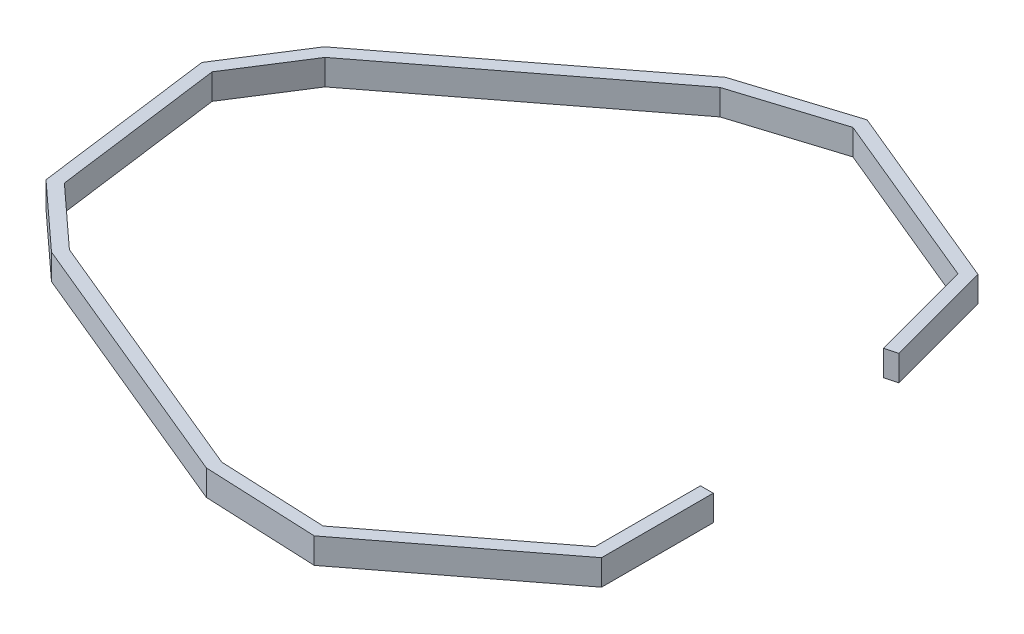
ISO-10303-21;
HEADER;
FILE_DESCRIPTION(('STEP AP214'),'2;1');
FILE_NAME('part.step','',(''),(''),'','','');
FILE_SCHEMA(('AUTOMOTIVE_DESIGN { 1 0 10303 214 1 1 1 1 }'));
ENDSEC;
DATA;
#1=APPLICATION_CONTEXT('core data for automotive mechanical design processes');
#2=APPLICATION_PROTOCOL_DEFINITION('international standard','automotive_design',2000,#1);
#3=PRODUCT_CONTEXT('',#1,'mechanical');
#4=PRODUCT('Part','Part','',(#3));
#5=PRODUCT_RELATED_PRODUCT_CATEGORY('part','',(#4));
#6=PRODUCT_DEFINITION_FORMATION('','',#4);
#7=PRODUCT_DEFINITION_CONTEXT('part definition',#1,'design');
#8=PRODUCT_DEFINITION('design','',#6,#7);
#9=PRODUCT_DEFINITION_SHAPE('','',#8);
#10=(LENGTH_UNIT() NAMED_UNIT(*) SI_UNIT(.MILLI.,.METRE.));
#11=(NAMED_UNIT(*) PLANE_ANGLE_UNIT() SI_UNIT($,.RADIAN.));
#12=(NAMED_UNIT(*) SI_UNIT($,.STERADIAN.) SOLID_ANGLE_UNIT());
#13=UNCERTAINTY_MEASURE_WITH_UNIT(LENGTH_MEASURE(1.E-05),#10,'distance_accuracy_value','');
#14=(GEOMETRIC_REPRESENTATION_CONTEXT(3) GLOBAL_UNCERTAINTY_ASSIGNED_CONTEXT((#13)) GLOBAL_UNIT_ASSIGNED_CONTEXT((#10,
#11,#12)) REPRESENTATION_CONTEXT('',''));
#15=CARTESIAN_POINT('',(0.,0.,0.));
#16=DIRECTION('',(0.,0.,1.));
#17=DIRECTION('',(1.,0.,0.));
#18=AXIS2_PLACEMENT_3D('',#15,#16,#17);
#19=CARTESIAN_POINT('',(0.,20.,0.));
#20=DIRECTION('',(0.,1.,0.));
#21=DIRECTION('',(0.,0.,1.));
#22=AXIS2_PLACEMENT_3D('',#19,#20,#21);
#23=PLANE('',#22);
#24=DIRECTION('',(0.999048221581858,0.,0.043619387365336));
#25=VECTOR('',#24,1.);
#26=CARTESIAN_POINT('',(-120.742582695956,20.,184.717138928303));
#27=LINE('',#26,#25);
#28=CARTESIAN_POINT('',(-117.106344543429,20.,184.875900514682));
#29=VERTEX_POINT('',#28);
#30=CARTESIAN_POINT('',(-205.339943630572,20.,181.023538382326));
#31=VERTEX_POINT('',#30);
#32=EDGE_CURVE('E218',#29,#31,#27,.F.);
#33=ORIENTED_EDGE('',*,*,#32,.F.);
#34=DIRECTION('',(0.793353340291236,0.,-0.60876142900872));
#35=VECTOR('',#34,1.);
#36=CARTESIAN_POINT('',(6.08761429008715,20.,90.3458511457558));
#37=LINE('',#36,#35);
#38=CARTESIAN_POINT('',(10.,20.,87.3437720031564));
#39=VERTEX_POINT('',#38);
#40=EDGE_CURVE('E212',#39,#29,#37,.F.);
#41=ORIENTED_EDGE('',*,*,#40,.F.);
#42=DIRECTION('',(0.,0.,-1.));
#43=VECTOR('',#42,1.);
#44=CARTESIAN_POINT('',(10.,20.,0.));
#45=LINE('',#44,#43);
#46=CARTESIAN_POINT('',(10.,20.,0.));
#47=VERTEX_POINT('',#46);
#48=EDGE_CURVE('E188',#47,#39,#45,.F.);
#49=ORIENTED_EDGE('',*,*,#48,.F.);
#50=DIRECTION('',(1.,0.,0.));
#51=VECTOR('',#50,1.);
#52=CARTESIAN_POINT('',(5.,20.,0.));
#53=LINE('',#52,#51);
#54=CARTESIAN_POINT('',(0.,20.,0.));
#55=VERTEX_POINT('',#54);
#56=EDGE_CURVE('E181',#47,#55,#53,.F.);
#57=ORIENTED_EDGE('',*,*,#56,.T.);
#58=DIRECTION('',(0.,0.,1.));
#59=VECTOR('',#58,1.);
#60=CARTESIAN_POINT('',(0.,20.,0.));
#61=LINE('',#60,#59);
#62=CARTESIAN_POINT('',(0.,20.,82.4123177428435));
#63=VERTEX_POINT('',#62);
#64=EDGE_CURVE('E20',#63,#55,#61,.F.);
#65=ORIENTED_EDGE('',*,*,#64,.F.);
#66=DIRECTION('',(-0.793353340291236,0.,0.60876142900872));
#67=VECTOR('',#66,1.);
#68=CARTESIAN_POINT('',(0.,20.,82.4123177428435));
#69=LINE('',#68,#67);
#70=CARTESIAN_POINT('',(-120.306388822301,20.,174.726656712485));
#71=VERTEX_POINT('',#70);
#72=EDGE_CURVE('E312',#71,#63,#69,.F.);
#73=ORIENTED_EDGE('',*,*,#72,.F.);
#74=DIRECTION('',(-0.999048221581858,0.,-0.043619387365336));
#75=VECTOR('',#74,1.);
#76=CARTESIAN_POINT('',(-120.306388822301,20.,174.726656712485));
#77=LINE('',#76,#75);
#78=CARTESIAN_POINT('',(-203.142158191982,20.,171.109968915253));
#79=VERTEX_POINT('',#78);
#80=EDGE_CURVE('E310',#79,#71,#77,.F.);
#81=ORIENTED_EDGE('',*,*,#80,.F.);
#82=DIRECTION('',(-0.923879532511286,0.,-0.382683432365092));
#83=VECTOR('',#82,1.);
#84=CARTESIAN_POINT('',(-203.142158191982,20.,171.109968915253));
#85=LINE('',#84,#83);
#86=CARTESIAN_POINT('',(-406.49950860378,20.,86.8765963664275));
#87=VERTEX_POINT('',#86);
#88=EDGE_CURVE('E305',#87,#79,#85,.F.);
#89=ORIENTED_EDGE('',*,*,#88,.F.);
#90=DIRECTION('',(-0.737277336810123,0.,-0.675590207615661));
#91=VECTOR('',#90,1.);
#92=CARTESIAN_POINT('',(-406.49950860378,20.,86.8765963664275));
#93=LINE('',#92,#91);
#94=CARTESIAN_POINT('',(-453.618871626954,20.,43.6996551284484));
#95=VERTEX_POINT('',#94);
#96=EDGE_CURVE('E300',#95,#87,#93,.F.);
#97=ORIENTED_EDGE('',*,*,#96,.F.);
#98=DIRECTION('',(-0.130526192220084,0.,-0.991444861373806));
#99=VECTOR('',#98,1.);
#100=CARTESIAN_POINT('',(-453.618871626955,20.,43.6996551284482));
#101=LINE('',#100,#99);
#102=CARTESIAN_POINT('',(-471.144892279142,20.,-89.4236883201037));
#103=VERTEX_POINT('',#102);
#104=EDGE_CURVE('E292',#103,#95,#101,.F.);
#105=ORIENTED_EDGE('',*,*,#104,.F.);
#106=DIRECTION('',(0.537299608346825,0.,-0.843391445812885));
#107=VECTOR('',#106,1.);
#108=CARTESIAN_POINT('',(-471.144892279141,20.,-89.423688320104));
#109=LINE('',#108,#107);
#110=CARTESIAN_POINT('',(-436.806097318427,20.,-143.324799505531));
#111=VERTEX_POINT('',#110);
#112=EDGE_CURVE('E289',#111,#103,#109,.F.);
#113=ORIENTED_EDGE('',*,*,#112,.F.);
#114=DIRECTION('',(0.793353340291235,0.,-0.608761429008721));
#115=VECTOR('',#114,1.);
#116=CARTESIAN_POINT('',(-436.806097318427,20.,-143.324799505531));
#117=LINE('',#116,#115);
#118=CARTESIAN_POINT('',(-262.179181638808,20.,-277.32074473403));
#119=VERTEX_POINT('',#118);
#120=EDGE_CURVE('E284',#119,#111,#117,.F.);
#121=ORIENTED_EDGE('',*,*,#120,.F.);
#122=DIRECTION('',(0.953716950748227,0.,-0.300705799504273));
#123=VECTOR('',#122,1.);
#124=CARTESIAN_POINT('',(-262.179181638807,20.,-277.32074473403));
#125=LINE('',#124,#123);
#126=CARTESIAN_POINT('',(-183.102040346221,20.,-302.253671611595));
#127=VERTEX_POINT('',#126);
#128=EDGE_CURVE('E279',#127,#119,#125,.F.);
#129=ORIENTED_EDGE('',*,*,#128,.F.);
#130=DIRECTION('',(0.923879532511296,0.,0.382683432365068));
#131=VECTOR('',#130,1.);
#132=CARTESIAN_POINT('',(-183.102040346221,20.,-302.253671611594));
#133=LINE('',#132,#131);
#134=CARTESIAN_POINT('',(-43.0022832537933,20.,-244.222452138736));
#135=VERTEX_POINT('',#134);
#136=EDGE_CURVE('E271',#135,#127,#133,.F.);
#137=ORIENTED_EDGE('',*,*,#136,.F.);
#138=DIRECTION('',(0.258819045102521,0.,0.965925826289068));
#139=VECTOR('',#138,1.);
#140=CARTESIAN_POINT('',(-43.0022832537934,20.,-244.222452138734));
#141=LINE('',#140,#139);
#142=CARTESIAN_POINT('',(-21.6724058709052,20.,-164.618266026581));
#143=VERTEX_POINT('',#142);
#144=EDGE_CURVE('E268',#143,#135,#141,.F.);
#145=ORIENTED_EDGE('',*,*,#144,.F.);
#146=DIRECTION('',(0.965925826289068,0.,-0.258819045102521));
#147=VECTOR('',#146,1.);
#148=CARTESIAN_POINT('',(-21.6724058709056,20.,-164.618266026581));
#149=LINE('',#148,#147);
#150=CARTESIAN_POINT('',(-12.0131476080145,20.,-167.206456477606));
#151=VERTEX_POINT('',#150);
#152=EDGE_CURVE('E263',#151,#143,#149,.F.);
#153=ORIENTED_EDGE('',*,*,#152,.F.);
#154=DIRECTION('',(-0.258819045102521,0.,-0.965925826289068));
#155=VECTOR('',#154,1.);
#156=CARTESIAN_POINT('',(-33.3430249909024,20.,-246.810642589758));
#157=LINE('',#156,#155);
#158=CARTESIAN_POINT('',(-34.619379273523,20.,-251.574061620961));
#159=VERTEX_POINT('',#158);
#160=EDGE_CURVE('E258',#159,#151,#157,.F.);
#161=ORIENTED_EDGE('',*,*,#160,.F.);
#162=DIRECTION('',(-0.923879532511296,0.,-0.382683432365068));
#163=VECTOR('',#162,1.);
#164=CARTESIAN_POINT('',(-179.275206022569,20.,-311.492466936707));
#165=LINE('',#164,#163);
#166=CARTESIAN_POINT('',(-182.637852521389,20.,-312.885320721984));
#167=VERTEX_POINT('',#166);
#168=EDGE_CURVE('E253',#167,#159,#165,.F.);
#169=ORIENTED_EDGE('',*,*,#168,.F.);
#170=DIRECTION('',(-0.953716950748227,0.,0.300705799504273));
#171=VECTOR('',#170,1.);
#172=CARTESIAN_POINT('',(-265.186239633849,20.,-286.857914241513));
#173=LINE('',#172,#171);
#174=CARTESIAN_POINT('',(-266.86789993761,20.,-286.327688784431));
#175=VERTEX_POINT('',#174);
#176=EDGE_CURVE('E248',#175,#167,#173,.F.);
#177=ORIENTED_EDGE('',*,*,#176,.F.);
#178=DIRECTION('',(-0.793353340291235,0.,0.608761429008721));
#179=VECTOR('',#178,1.);
#180=CARTESIAN_POINT('',(-442.893711608513,20.,-151.258332908444));
#181=LINE('',#180,#179);
#182=CARTESIAN_POINT('',(-444.2926075998,20.,-150.184922260955));
#183=VERTEX_POINT('',#182);
#184=EDGE_CURVE('E243',#183,#175,#181,.F.);
#185=ORIENTED_EDGE('',*,*,#184,.F.);
#186=DIRECTION('',(-0.537299608346825,0.,0.843391445812885));
#187=VECTOR('',#186,1.);
#188=CARTESIAN_POINT('',(-479.578806737269,20.,-94.7966844035736));
#189=LINE('',#188,#187);
#190=CARTESIAN_POINT('',(-481.534417380484,20.,-91.7269905824655));
#191=VERTEX_POINT('',#190);
#192=EDGE_CURVE('E238',#191,#183,#189,.F.);
#193=ORIENTED_EDGE('',*,*,#192,.F.);
#194=DIRECTION('',(0.130526192220084,0.,0.991444861373806));
#195=VECTOR('',#194,1.);
#196=CARTESIAN_POINT('',(-463.533320240693,20.,45.0049170506473));
#197=LINE('',#196,#195);
#198=CARTESIAN_POINT('',(-463.05824375309,20.,48.6134812352115));
#199=VERTEX_POINT('',#198);
#200=EDGE_CURVE('E233',#199,#191,#197,.F.);
#201=ORIENTED_EDGE('',*,*,#200,.F.);
#202=DIRECTION('',(0.737277336810123,0.,0.675590207615661));
#203=VECTOR('',#202,1.);
#204=CARTESIAN_POINT('',(-413.255410679938,20.,94.2493697345275));
#205=LINE('',#204,#203);
#206=CARTESIAN_POINT('',(-411.955391812491,20.,95.4406175495795));
#207=VERTEX_POINT('',#206);
#208=EDGE_CURVE('E228',#207,#199,#205,.F.);
#209=ORIENTED_EDGE('',*,*,#208,.F.);
#210=DIRECTION('',(0.923879532511286,0.,0.382683432365092));
#211=VECTOR('',#210,1.);
#212=CARTESIAN_POINT('',(-206.968992515634,20.,180.348764240365));
#213=LINE('',#212,#211);
#214=EDGE_CURVE('E223',#31,#207,#213,.F.);
#215=ORIENTED_EDGE('',*,*,#214,.F.);
#216=EDGE_LOOP('',(#33,#41,#49,#57,#65,#73,#81,#89,#97,#105,#113,#121,#129,#137,#145,#153,#161,
#169,#177,#185,#193,#201,#209,#215));
#217=FACE_BOUND('',#216,.T.);
#218=ADVANCED_FACE('F17',(#217),#23,.T.);
#219=CARTESIAN_POINT('',(0.,0.,0.));
#220=DIRECTION('',(-1.,0.,0.));
#221=DIRECTION('',(0.,0.,1.));
#222=AXIS2_PLACEMENT_3D('',#219,#220,#221);
#223=PLANE('',#222);
#224=DIRECTION('',(0.,1.,0.));
#225=VECTOR('',#224,1.);
#226=CARTESIAN_POINT('',(0.,10.,0.));
#227=LINE('',#226,#225);
#228=CARTESIAN_POINT('',(0.,0.,0.));
#229=VERTEX_POINT('',#228);
#230=EDGE_CURVE('E190',#55,#229,#227,.F.);
#231=ORIENTED_EDGE('',*,*,#230,.T.);
#232=DIRECTION('',(0.,0.,-1.));
#233=VECTOR('',#232,1.);
#234=CARTESIAN_POINT('',(0.,0.,0.));
#235=LINE('',#234,#233);
#236=CARTESIAN_POINT('',(0.,0.,82.4123177428435));
#237=VERTEX_POINT('',#236);
#238=EDGE_CURVE('E318',#237,#229,#235,.T.);
#239=ORIENTED_EDGE('',*,*,#238,.F.);
#240=DIRECTION('',(0.,1.,0.));
#241=VECTOR('',#240,1.);
#242=CARTESIAN_POINT('',(0.,0.,82.4123177428434));
#243=LINE('',#242,#241);
#244=EDGE_CURVE('E195',#63,#237,#243,.F.);
#245=ORIENTED_EDGE('',*,*,#244,.F.);
#246=ORIENTED_EDGE('',*,*,#64,.T.);
#247=EDGE_LOOP('',(#231,#239,#245,#246));
#248=FACE_BOUND('',#247,.T.);
#249=ADVANCED_FACE('F192',(#248),#223,.T.);
#250=CARTESIAN_POINT('',(5.,10.,0.));
#251=DIRECTION('',(0.,0.,1.));
#252=DIRECTION('',(1.,0.,0.));
#253=AXIS2_PLACEMENT_3D('',#250,#251,#252);
#254=PLANE('',#253);
#255=ORIENTED_EDGE('',*,*,#230,.F.);
#256=ORIENTED_EDGE('',*,*,#56,.F.);
#257=DIRECTION('',(0.,1.,0.));
#258=VECTOR('',#257,1.);
#259=CARTESIAN_POINT('',(10.,20.,0.));
#260=LINE('',#259,#258);
#261=CARTESIAN_POINT('',(10.,0.,0.));
#262=VERTEX_POINT('',#261);
#263=EDGE_CURVE('E202',#262,#47,#260,.T.);
#264=ORIENTED_EDGE('',*,*,#263,.F.);
#265=DIRECTION('',(1.,0.,0.));
#266=VECTOR('',#265,1.);
#267=CARTESIAN_POINT('',(10.,0.,0.));
#268=LINE('',#267,#266);
#269=EDGE_CURVE('E200',#229,#262,#268,.T.);
#270=ORIENTED_EDGE('',*,*,#269,.F.);
#271=EDGE_LOOP('',(#255,#256,#264,#270));
#272=FACE_BOUND('',#271,.T.);
#273=ADVANCED_FACE('F198',(#272),#254,.F.);
#274=CARTESIAN_POINT('',(10.,20.,0.));
#275=DIRECTION('',(1.,0.,0.));
#276=DIRECTION('',(0.,0.,-1.));
#277=AXIS2_PLACEMENT_3D('',#274,#275,#276);
#278=PLANE('',#277);
#279=ORIENTED_EDGE('',*,*,#48,.T.);
#280=DIRECTION('',(0.,1.,0.));
#281=VECTOR('',#280,1.);
#282=CARTESIAN_POINT('',(10.0000000000001,20.,87.3437720031564));
#283=LINE('',#282,#281);
#284=CARTESIAN_POINT('',(10.,0.,87.3437720031564));
#285=VERTEX_POINT('',#284);
#286=EDGE_CURVE('E208',#285,#39,#283,.T.);
#287=ORIENTED_EDGE('',*,*,#286,.F.);
#288=DIRECTION('',(0.,0.,-1.));
#289=VECTOR('',#288,1.);
#290=CARTESIAN_POINT('',(10.,0.,0.));
#291=LINE('',#290,#289);
#292=EDGE_CURVE('E322',#262,#285,#291,.F.);
#293=ORIENTED_EDGE('',*,*,#292,.F.);
#294=ORIENTED_EDGE('',*,*,#263,.T.);
#295=EDGE_LOOP('',(#279,#287,#293,#294));
#296=FACE_BOUND('',#295,.T.);
#297=ADVANCED_FACE('F479',(#296),#278,.T.);
#298=CARTESIAN_POINT('',(6.08761429008715,20.,90.3458511457558));
#299=DIRECTION('',(0.60876142900872,0.,0.793353340291236));
#300=DIRECTION('',(0.793353340291236,0.,-0.60876142900872));
#301=AXIS2_PLACEMENT_3D('',#298,#299,#300);
#302=PLANE('',#301);
#303=ORIENTED_EDGE('',*,*,#40,.T.);
#304=DIRECTION('',(0.,1.,0.));
#305=VECTOR('',#304,1.);
#306=CARTESIAN_POINT('',(-117.106344543429,20.,184.875900514683));
#307=LINE('',#306,#305);
#308=CARTESIAN_POINT('',(-117.106344543429,0.,184.875900514682));
#309=VERTEX_POINT('',#308);
#310=EDGE_CURVE('E215',#309,#29,#307,.T.);
#311=ORIENTED_EDGE('',*,*,#310,.F.);
#312=DIRECTION('',(-0.793353340291232,0.,0.608761429008725));
#313=VECTOR('',#312,1.);
#314=CARTESIAN_POINT('',(10.,0.,87.3437720031563));
#315=LINE('',#314,#313);
#316=EDGE_CURVE('E326',#285,#309,#315,.T.);
#317=ORIENTED_EDGE('',*,*,#316,.F.);
#318=ORIENTED_EDGE('',*,*,#286,.T.);
#319=EDGE_LOOP('',(#303,#311,#317,#318));
#320=FACE_BOUND('',#319,.T.);
#321=ADVANCED_FACE('F475',(#320),#302,.T.);
#322=CARTESIAN_POINT('',(-120.742582695956,20.,184.717138928303));
#323=DIRECTION('',(-0.043619387365336,0.,0.999048221581858));
#324=DIRECTION('',(0.999048221581858,0.,0.043619387365336));
#325=AXIS2_PLACEMENT_3D('',#322,#323,#324);
#326=PLANE('',#325);
#327=ORIENTED_EDGE('',*,*,#32,.T.);
#328=DIRECTION('',(0.,1.,0.));
#329=VECTOR('',#328,1.);
#330=CARTESIAN_POINT('',(-205.339943630572,20.,181.023538382326));
#331=LINE('',#330,#329);
#332=CARTESIAN_POINT('',(-205.339943630572,0.,181.023538382326));
#333=VERTEX_POINT('',#332);
#334=EDGE_CURVE('E220',#333,#31,#331,.T.);
#335=ORIENTED_EDGE('',*,*,#334,.F.);
#336=DIRECTION('',(-0.999048221581858,0.,-0.043619387365336));
#337=VECTOR('',#336,1.);
#338=CARTESIAN_POINT('',(-117.106344543429,0.,184.875900514683));
#339=LINE('',#338,#337);
#340=EDGE_CURVE('E330',#309,#333,#339,.T.);
#341=ORIENTED_EDGE('',*,*,#340,.F.);
#342=ORIENTED_EDGE('',*,*,#310,.T.);
#343=EDGE_LOOP('',(#327,#335,#341,#342));
#344=FACE_BOUND('',#343,.T.);
#345=ADVANCED_FACE('F471',(#344),#326,.T.);
#346=CARTESIAN_POINT('',(-206.968992515634,20.,180.348764240365));
#347=DIRECTION('',(-0.382683432365092,0.,0.923879532511286));
#348=DIRECTION('',(0.923879532511286,0.,0.382683432365092));
#349=AXIS2_PLACEMENT_3D('',#346,#347,#348);
#350=PLANE('',#349);
#351=ORIENTED_EDGE('',*,*,#214,.T.);
#352=DIRECTION('',(0.,1.,0.));
#353=VECTOR('',#352,1.);
#354=CARTESIAN_POINT('',(-411.955391812491,20.,95.4406175495795));
#355=LINE('',#354,#353);
#356=CARTESIAN_POINT('',(-411.955391812491,0.,95.4406175495796));
#357=VERTEX_POINT('',#356);
#358=EDGE_CURVE('E225',#357,#207,#355,.T.);
#359=ORIENTED_EDGE('',*,*,#358,.F.);
#360=DIRECTION('',(-0.923879532511286,0.,-0.382683432365092));
#361=VECTOR('',#360,1.);
#362=CARTESIAN_POINT('',(-205.339943630572,0.,181.023538382326));
#363=LINE('',#362,#361);
#364=EDGE_CURVE('E333',#333,#357,#363,.T.);
#365=ORIENTED_EDGE('',*,*,#364,.F.);
#366=ORIENTED_EDGE('',*,*,#334,.T.);
#367=EDGE_LOOP('',(#351,#359,#365,#366));
#368=FACE_BOUND('',#367,.T.);
#369=ADVANCED_FACE('F467',(#368),#350,.T.);
#370=CARTESIAN_POINT('',(-413.255410679938,20.,94.2493697345275));
#371=DIRECTION('',(-0.675590207615661,0.,0.737277336810123));
#372=DIRECTION('',(0.737277336810123,0.,0.675590207615661));
#373=AXIS2_PLACEMENT_3D('',#370,#371,#372);
#374=PLANE('',#373);
#375=ORIENTED_EDGE('',*,*,#208,.T.);
#376=DIRECTION('',(0.,1.,0.));
#377=VECTOR('',#376,1.);
#378=CARTESIAN_POINT('',(-463.05824375309,20.,48.6134812352115));
#379=LINE('',#378,#377);
#380=CARTESIAN_POINT('',(-463.05824375309,0.,48.6134812352115));
#381=VERTEX_POINT('',#380);
#382=EDGE_CURVE('E230',#381,#199,#379,.T.);
#383=ORIENTED_EDGE('',*,*,#382,.F.);
#384=DIRECTION('',(-0.737277336810124,0.,-0.675590207615661));
#385=VECTOR('',#384,1.);
#386=CARTESIAN_POINT('',(-411.955391812491,0.,95.4406175495795));
#387=LINE('',#386,#385);
#388=EDGE_CURVE('E336',#357,#381,#387,.T.);
#389=ORIENTED_EDGE('',*,*,#388,.F.);
#390=ORIENTED_EDGE('',*,*,#358,.T.);
#391=EDGE_LOOP('',(#375,#383,#389,#390));
#392=FACE_BOUND('',#391,.T.);
#393=ADVANCED_FACE('F463',(#392),#374,.T.);
#394=CARTESIAN_POINT('',(-463.533320240693,20.,45.0049170506473));
#395=DIRECTION('',(-0.991444861373806,0.,0.130526192220084));
#396=DIRECTION('',(0.130526192220084,0.,0.991444861373806));
#397=AXIS2_PLACEMENT_3D('',#394,#395,#396);
#398=PLANE('',#397);
#399=ORIENTED_EDGE('',*,*,#200,.T.);
#400=DIRECTION('',(0.,1.,0.));
#401=VECTOR('',#400,1.);
#402=CARTESIAN_POINT('',(-481.534417380481,20.,-91.7269905824657));
#403=LINE('',#402,#401);
#404=CARTESIAN_POINT('',(-481.534417380484,0.,-91.7269905824654));
#405=VERTEX_POINT('',#404);
#406=EDGE_CURVE('E235',#405,#191,#403,.T.);
#407=ORIENTED_EDGE('',*,*,#406,.F.);
#408=DIRECTION('',(-0.130526192220054,0.,-0.99144486137381));
#409=VECTOR('',#408,1.);
#410=CARTESIAN_POINT('',(-463.05824375309,0.,48.6134812352115));
#411=LINE('',#410,#409);
#412=EDGE_CURVE('E339',#381,#405,#411,.T.);
#413=ORIENTED_EDGE('',*,*,#412,.F.);
#414=ORIENTED_EDGE('',*,*,#382,.T.);
#415=EDGE_LOOP('',(#399,#407,#413,#414));
#416=FACE_BOUND('',#415,.T.);
#417=ADVANCED_FACE('F459',(#416),#398,.T.);
#418=CARTESIAN_POINT('',(-479.578806737269,20.,-94.7966844035736));
#419=DIRECTION('',(-0.843391445812885,0.,-0.537299608346825));
#420=DIRECTION('',(-0.537299608346825,0.,0.843391445812885));
#421=AXIS2_PLACEMENT_3D('',#418,#419,#420);
#422=PLANE('',#421);
#423=ORIENTED_EDGE('',*,*,#192,.T.);
#424=DIRECTION('',(0.,1.,0.));
#425=VECTOR('',#424,1.);
#426=CARTESIAN_POINT('',(-444.2926075998,20.,-150.184922260955));
#427=LINE('',#426,#425);
#428=CARTESIAN_POINT('',(-444.2926075998,0.,-150.184922260955));
#429=VERTEX_POINT('',#428);
#430=EDGE_CURVE('E240',#429,#183,#427,.T.);
#431=ORIENTED_EDGE('',*,*,#430,.F.);
#432=DIRECTION('',(0.537299608346826,0.,-0.843391445812884));
#433=VECTOR('',#432,1.);
#434=CARTESIAN_POINT('',(-481.534417380482,0.,-91.7269905824658));
#435=LINE('',#434,#433);
#436=EDGE_CURVE('E342',#405,#429,#435,.T.);
#437=ORIENTED_EDGE('',*,*,#436,.F.);
#438=ORIENTED_EDGE('',*,*,#406,.T.);
#439=EDGE_LOOP('',(#423,#431,#437,#438));
#440=FACE_BOUND('',#439,.T.);
#441=ADVANCED_FACE('F455',(#440),#422,.T.);
#442=CARTESIAN_POINT('',(-442.893711608513,20.,-151.258332908444));
#443=DIRECTION('',(-0.608761429008721,0.,-0.793353340291235));
#444=DIRECTION('',(-0.793353340291235,0.,0.608761429008721));
#445=AXIS2_PLACEMENT_3D('',#442,#443,#444);
#446=PLANE('',#445);
#447=ORIENTED_EDGE('',*,*,#184,.T.);
#448=DIRECTION('',(0.,1.,0.));
#449=VECTOR('',#448,1.);
#450=CARTESIAN_POINT('',(-266.86789993761,20.,-286.327688784431));
#451=LINE('',#450,#449);
#452=CARTESIAN_POINT('',(-266.86789993761,0.,-286.327688784431));
#453=VERTEX_POINT('',#452);
#454=EDGE_CURVE('E245',#453,#175,#451,.T.);
#455=ORIENTED_EDGE('',*,*,#454,.F.);
#456=DIRECTION('',(0.793353340291235,0.,-0.608761429008722));
#457=VECTOR('',#456,1.);
#458=CARTESIAN_POINT('',(-444.2926075998,0.,-150.184922260955));
#459=LINE('',#458,#457);
#460=EDGE_CURVE('E345',#429,#453,#459,.T.);
#461=ORIENTED_EDGE('',*,*,#460,.F.);
#462=ORIENTED_EDGE('',*,*,#430,.T.);
#463=EDGE_LOOP('',(#447,#455,#461,#462));
#464=FACE_BOUND('',#463,.T.);
#465=ADVANCED_FACE('F451',(#464),#446,.T.);
#466=CARTESIAN_POINT('',(-265.186239633849,20.,-286.857914241513));
#467=DIRECTION('',(-0.300705799504273,0.,-0.953716950748227));
#468=DIRECTION('',(-0.953716950748227,0.,0.300705799504273));
#469=AXIS2_PLACEMENT_3D('',#466,#467,#468);
#470=PLANE('',#469);
#471=ORIENTED_EDGE('',*,*,#176,.T.);
#472=DIRECTION('',(0.,1.,0.));
#473=VECTOR('',#472,1.);
#474=CARTESIAN_POINT('',(-182.637852521389,20.,-312.885320721984));
#475=LINE('',#474,#473);
#476=CARTESIAN_POINT('',(-182.637852521389,0.,-312.885320721984));
#477=VERTEX_POINT('',#476);
#478=EDGE_CURVE('E250',#477,#167,#475,.T.);
#479=ORIENTED_EDGE('',*,*,#478,.F.);
#480=DIRECTION('',(0.953716950748227,0.,-0.300705799504273));
#481=VECTOR('',#480,1.);
#482=CARTESIAN_POINT('',(-266.86789993761,0.,-286.327688784431));
#483=LINE('',#482,#481);
#484=EDGE_CURVE('E348',#453,#477,#483,.T.);
#485=ORIENTED_EDGE('',*,*,#484,.F.);
#486=ORIENTED_EDGE('',*,*,#454,.T.);
#487=EDGE_LOOP('',(#471,#479,#485,#486));
#488=FACE_BOUND('',#487,.T.);
#489=ADVANCED_FACE('F447',(#488),#470,.T.);
#490=CARTESIAN_POINT('',(-179.275206022569,20.,-311.492466936707));
#491=DIRECTION('',(0.382683432365068,0.,-0.923879532511296));
#492=DIRECTION('',(-0.923879532511296,0.,-0.382683432365068));
#493=AXIS2_PLACEMENT_3D('',#490,#491,#492);
#494=PLANE('',#493);
#495=ORIENTED_EDGE('',*,*,#168,.T.);
#496=DIRECTION('',(0.,1.,0.));
#497=VECTOR('',#496,1.);
#498=CARTESIAN_POINT('',(-34.6193792735237,20.,-251.574061620959));
#499=LINE('',#498,#497);
#500=CARTESIAN_POINT('',(-34.619379273523,0.,-251.574061620961));
#501=VERTEX_POINT('',#500);
#502=EDGE_CURVE('E255',#501,#159,#499,.T.);
#503=ORIENTED_EDGE('',*,*,#502,.F.);
#504=DIRECTION('',(0.923879532511286,0.,0.382683432365091));
#505=VECTOR('',#504,1.);
#506=CARTESIAN_POINT('',(-182.637852521389,0.,-312.885320721985));
#507=LINE('',#506,#505);
#508=EDGE_CURVE('E351',#477,#501,#507,.T.);
#509=ORIENTED_EDGE('',*,*,#508,.F.);
#510=ORIENTED_EDGE('',*,*,#478,.T.);
#511=EDGE_LOOP('',(#495,#503,#509,#510));
#512=FACE_BOUND('',#511,.T.);
#513=ADVANCED_FACE('F443',(#512),#494,.T.);
#514=CARTESIAN_POINT('',(-33.3430249909024,20.,-246.810642589758));
#515=DIRECTION('',(0.965925826289068,0.,-0.258819045102521));
#516=DIRECTION('',(-0.258819045102521,0.,-0.965925826289068));
#517=AXIS2_PLACEMENT_3D('',#514,#515,#516);
#518=PLANE('',#517);
#519=ORIENTED_EDGE('',*,*,#502,.T.);
#520=ORIENTED_EDGE('',*,*,#160,.T.);
#521=DIRECTION('',(0.,1.,0.));
#522=VECTOR('',#521,1.);
#523=CARTESIAN_POINT('',(-12.0131476080145,0.,-167.206456477606));
#524=LINE('',#523,#522);
#525=CARTESIAN_POINT('',(-12.0131476080145,0.,-167.206456477606));
#526=VERTEX_POINT('',#525);
#527=EDGE_CURVE('E260',#526,#151,#524,.T.);
#528=ORIENTED_EDGE('',*,*,#527,.F.);
#529=DIRECTION('',(0.25881904510252,0.,0.965925826289068));
#530=VECTOR('',#529,1.);
#531=CARTESIAN_POINT('',(-34.6193792735237,0.,-251.574061620959));
#532=LINE('',#531,#530);
#533=EDGE_CURVE('E354',#501,#526,#532,.T.);
#534=ORIENTED_EDGE('',*,*,#533,.F.);
#535=EDGE_LOOP('',(#519,#520,#528,#534));
#536=FACE_BOUND('',#535,.T.);
#537=ADVANCED_FACE('F439',(#536),#518,.T.);
#538=CARTESIAN_POINT('',(-21.6724058709056,0.,-164.618266026581));
#539=DIRECTION('',(0.258819045102521,0.,0.965925826289068));
#540=DIRECTION('',(0.965925826289068,0.,-0.258819045102521));
#541=AXIS2_PLACEMENT_3D('',#538,#539,#540);
#542=PLANE('',#541);
#543=ORIENTED_EDGE('',*,*,#527,.T.);
#544=ORIENTED_EDGE('',*,*,#152,.T.);
#545=DIRECTION('',(0.,1.,0.));
#546=VECTOR('',#545,1.);
#547=CARTESIAN_POINT('',(-21.6724058709051,0.,-164.618266026581));
#548=LINE('',#547,#546);
#549=CARTESIAN_POINT('',(-21.6724058709052,0.,-164.618266026581));
#550=VERTEX_POINT('',#549);
#551=EDGE_CURVE('E265',#550,#143,#548,.T.);
#552=ORIENTED_EDGE('',*,*,#551,.F.);
#553=DIRECTION('',(-0.965925826289067,0.,0.258819045102524));
#554=VECTOR('',#553,1.);
#555=CARTESIAN_POINT('',(-12.0131476080145,0.,-167.206456477606));
#556=LINE('',#555,#554);
#557=EDGE_CURVE('E357',#526,#550,#556,.T.);
#558=ORIENTED_EDGE('',*,*,#557,.F.);
#559=EDGE_LOOP('',(#543,#544,#552,#558));
#560=FACE_BOUND('',#559,.T.);
#561=ADVANCED_FACE('F435',(#560),#542,.T.);
#562=CARTESIAN_POINT('',(-43.0022832537934,0.,-244.222452138734));
#563=DIRECTION('',(-0.965925826289068,0.,0.258819045102521));
#564=DIRECTION('',(0.258819045102521,0.,0.965925826289068));
#565=AXIS2_PLACEMENT_3D('',#562,#563,#564);
#566=PLANE('',#565);
#567=DIRECTION('',(0.,1.,0.));
#568=VECTOR('',#567,1.);
#569=CARTESIAN_POINT('',(-43.0022832537923,0.,-244.222452138738));
#570=LINE('',#569,#568);
#571=CARTESIAN_POINT('',(-43.0022832537933,0.,-244.222452138736));
#572=VERTEX_POINT('',#571);
#573=EDGE_CURVE('E273',#572,#135,#570,.T.);
#574=ORIENTED_EDGE('',*,*,#573,.F.);
#575=DIRECTION('',(-0.258819045102523,0.,-0.965925826289068));
#576=VECTOR('',#575,1.);
#577=CARTESIAN_POINT('',(-21.6724058709052,0.,-164.618266026581));
#578=LINE('',#577,#576);
#579=EDGE_CURVE('E360',#550,#572,#578,.T.);
#580=ORIENTED_EDGE('',*,*,#579,.F.);
#581=ORIENTED_EDGE('',*,*,#551,.T.);
#582=ORIENTED_EDGE('',*,*,#144,.T.);
#583=EDGE_LOOP('',(#574,#580,#581,#582));
#584=FACE_BOUND('',#583,.T.);
#585=ADVANCED_FACE('F431',(#584),#566,.T.);
#586=CARTESIAN_POINT('',(-183.102040346221,0.,-302.253671611594));
#587=DIRECTION('',(-0.382683432365068,0.,0.923879532511296));
#588=DIRECTION('',(0.923879532511296,0.,0.382683432365068));
#589=AXIS2_PLACEMENT_3D('',#586,#587,#588);
#590=PLANE('',#589);
#591=DIRECTION('',(-0.923879532511287,0.,-0.38268343236509));
#592=VECTOR('',#591,1.);
#593=CARTESIAN_POINT('',(-43.0022832537937,0.,-244.222452138735));
#594=LINE('',#593,#592);
#595=CARTESIAN_POINT('',(-183.102040346221,0.,-302.253671611595));
#596=VERTEX_POINT('',#595);
#597=EDGE_CURVE('E363',#572,#596,#594,.T.);
#598=ORIENTED_EDGE('',*,*,#597,.F.);
#599=ORIENTED_EDGE('',*,*,#573,.T.);
#600=ORIENTED_EDGE('',*,*,#136,.T.);
#601=DIRECTION('',(0.,1.,0.));
#602=VECTOR('',#601,1.);
#603=CARTESIAN_POINT('',(-183.102040346221,0.,-302.253671611594));
#604=LINE('',#603,#602);
#605=EDGE_CURVE('E276',#596,#127,#604,.T.);
#606=ORIENTED_EDGE('',*,*,#605,.F.);
#607=EDGE_LOOP('',(#598,#599,#600,#606));
#608=FACE_BOUND('',#607,.T.);
#609=ADVANCED_FACE('F427',(#608),#590,.T.);
#610=CARTESIAN_POINT('',(-262.179181638807,0.,-277.32074473403));
#611=DIRECTION('',(0.300705799504273,0.,0.953716950748227));
#612=DIRECTION('',(0.953716950748227,0.,-0.300705799504273));
#613=AXIS2_PLACEMENT_3D('',#610,#611,#612);
#614=PLANE('',#613);
#615=DIRECTION('',(0.,1.,0.));
#616=VECTOR('',#615,1.);
#617=CARTESIAN_POINT('',(-262.179181638808,0.,-277.32074473403));
#618=LINE('',#617,#616);
#619=CARTESIAN_POINT('',(-262.179181638808,0.,-277.32074473403));
#620=VERTEX_POINT('',#619);
#621=EDGE_CURVE('E281',#620,#119,#618,.T.);
#622=ORIENTED_EDGE('',*,*,#621,.F.);
#623=DIRECTION('',(-0.953716950748227,0.,0.300705799504273));
#624=VECTOR('',#623,1.);
#625=CARTESIAN_POINT('',(-183.102040346221,0.,-302.253671611594));
#626=LINE('',#625,#624);
#627=EDGE_CURVE('E366',#596,#620,#626,.T.);
#628=ORIENTED_EDGE('',*,*,#627,.F.);
#629=ORIENTED_EDGE('',*,*,#605,.T.);
#630=ORIENTED_EDGE('',*,*,#128,.T.);
#631=EDGE_LOOP('',(#622,#628,#629,#630));
#632=FACE_BOUND('',#631,.T.);
#633=ADVANCED_FACE('F423',(#632),#614,.T.);
#634=CARTESIAN_POINT('',(-436.806097318427,0.,-143.324799505531));
#635=DIRECTION('',(0.608761429008721,0.,0.793353340291235));
#636=DIRECTION('',(0.793353340291235,0.,-0.608761429008721));
#637=AXIS2_PLACEMENT_3D('',#634,#635,#636);
#638=PLANE('',#637);
#639=DIRECTION('',(0.,1.,0.));
#640=VECTOR('',#639,1.);
#641=CARTESIAN_POINT('',(-436.806097318427,0.,-143.324799505531));
#642=LINE('',#641,#640);
#643=CARTESIAN_POINT('',(-436.806097318427,0.,-143.324799505531));
#644=VERTEX_POINT('',#643);
#645=EDGE_CURVE('E286',#644,#111,#642,.T.);
#646=ORIENTED_EDGE('',*,*,#645,.F.);
#647=DIRECTION('',(-0.793353340291234,0.,0.608761429008721));
#648=VECTOR('',#647,1.);
#649=CARTESIAN_POINT('',(-262.179181638808,0.,-277.32074473403));
#650=LINE('',#649,#648);
#651=EDGE_CURVE('E369',#620,#644,#650,.T.);
#652=ORIENTED_EDGE('',*,*,#651,.F.);
#653=ORIENTED_EDGE('',*,*,#621,.T.);
#654=ORIENTED_EDGE('',*,*,#120,.T.);
#655=EDGE_LOOP('',(#646,#652,#653,#654));
#656=FACE_BOUND('',#655,.T.);
#657=ADVANCED_FACE('F419',(#656),#638,.T.);
#658=CARTESIAN_POINT('',(-471.144892279141,0.,-89.423688320104));
#659=DIRECTION('',(0.843391445812885,0.,0.537299608346825));
#660=DIRECTION('',(0.537299608346825,0.,-0.843391445812885));
#661=AXIS2_PLACEMENT_3D('',#658,#659,#660);
#662=PLANE('',#661);
#663=DIRECTION('',(0.,1.,0.));
#664=VECTOR('',#663,1.);
#665=CARTESIAN_POINT('',(-471.144892279145,0.,-89.4236883201033));
#666=LINE('',#665,#664);
#667=CARTESIAN_POINT('',(-471.144892279142,0.,-89.4236883201037));
#668=VERTEX_POINT('',#667);
#669=EDGE_CURVE('E294',#668,#103,#666,.T.);
#670=ORIENTED_EDGE('',*,*,#669,.F.);
#671=DIRECTION('',(-0.537299608346825,0.,0.843391445812885));
#672=VECTOR('',#671,1.);
#673=CARTESIAN_POINT('',(-436.806097318427,0.,-143.324799505531));
#674=LINE('',#673,#672);
#675=EDGE_CURVE('E372',#644,#668,#674,.T.);
#676=ORIENTED_EDGE('',*,*,#675,.F.);
#677=ORIENTED_EDGE('',*,*,#645,.T.);
#678=ORIENTED_EDGE('',*,*,#112,.T.);
#679=EDGE_LOOP('',(#670,#676,#677,#678));
#680=FACE_BOUND('',#679,.T.);
#681=ADVANCED_FACE('F415',(#680),#662,.T.);
#682=CARTESIAN_POINT('',(-453.618871626955,0.,43.6996551284482));
#683=DIRECTION('',(0.991444861373806,0.,-0.130526192220084));
#684=DIRECTION('',(-0.130526192220084,0.,-0.991444861373806));
#685=AXIS2_PLACEMENT_3D('',#682,#683,#684);
#686=PLANE('',#685);
#687=DIRECTION('',(0.130526192220052,0.,0.99144486137381));
#688=VECTOR('',#687,1.);
#689=CARTESIAN_POINT('',(-471.144892279141,0.,-89.4236883201038));
#690=LINE('',#689,#688);
#691=CARTESIAN_POINT('',(-453.618871626954,0.,43.6996551284484));
#692=VERTEX_POINT('',#691);
#693=EDGE_CURVE('E375',#668,#692,#690,.T.);
#694=ORIENTED_EDGE('',*,*,#693,.F.);
#695=ORIENTED_EDGE('',*,*,#669,.T.);
#696=ORIENTED_EDGE('',*,*,#104,.T.);
#697=DIRECTION('',(0.,1.,0.));
#698=VECTOR('',#697,1.);
#699=CARTESIAN_POINT('',(-453.618871626954,0.,43.6996551284484));
#700=LINE('',#699,#698);
#701=EDGE_CURVE('E297',#692,#95,#700,.T.);
#702=ORIENTED_EDGE('',*,*,#701,.F.);
#703=EDGE_LOOP('',(#694,#695,#696,#702));
#704=FACE_BOUND('',#703,.T.);
#705=ADVANCED_FACE('F411',(#704),#686,.T.);
#706=CARTESIAN_POINT('',(-406.49950860378,0.,86.8765963664275));
#707=DIRECTION('',(0.675590207615661,0.,-0.737277336810123));
#708=DIRECTION('',(-0.737277336810123,0.,-0.675590207615661));
#709=AXIS2_PLACEMENT_3D('',#706,#707,#708);
#710=PLANE('',#709);
#711=DIRECTION('',(0.,1.,0.));
#712=VECTOR('',#711,1.);
#713=CARTESIAN_POINT('',(-406.49950860378,0.,86.8765963664274));
#714=LINE('',#713,#712);
#715=CARTESIAN_POINT('',(-406.49950860378,0.,86.8765963664275));
#716=VERTEX_POINT('',#715);
#717=EDGE_CURVE('E302',#716,#87,#714,.T.);
#718=ORIENTED_EDGE('',*,*,#717,.F.);
#719=DIRECTION('',(0.737277336810123,0.,0.675590207615661));
#720=VECTOR('',#719,1.);
#721=CARTESIAN_POINT('',(-453.618871626954,0.,43.6996551284484));
#722=LINE('',#721,#720);
#723=EDGE_CURVE('E378',#692,#716,#722,.T.);
#724=ORIENTED_EDGE('',*,*,#723,.F.);
#725=ORIENTED_EDGE('',*,*,#701,.T.);
#726=ORIENTED_EDGE('',*,*,#96,.T.);
#727=EDGE_LOOP('',(#718,#724,#725,#726));
#728=FACE_BOUND('',#727,.T.);
#729=ADVANCED_FACE('F408',(#728),#710,.T.);
#730=CARTESIAN_POINT('',(-203.142158191982,0.,171.109968915253));
#731=DIRECTION('',(0.382683432365092,0.,-0.923879532511286));
#732=DIRECTION('',(-0.923879532511286,0.,-0.382683432365092));
#733=AXIS2_PLACEMENT_3D('',#730,#731,#732);
#734=PLANE('',#733);
#735=DIRECTION('',(0.,1.,0.));
#736=VECTOR('',#735,1.);
#737=CARTESIAN_POINT('',(-203.142158191982,0.,171.109968915253));
#738=LINE('',#737,#736);
#739=CARTESIAN_POINT('',(-203.142158191982,0.,171.109968915253));
#740=VERTEX_POINT('',#739);
#741=EDGE_CURVE('E307',#740,#79,#738,.T.);
#742=ORIENTED_EDGE('',*,*,#741,.F.);
#743=DIRECTION('',(0.923879532511286,0.,0.382683432365092));
#744=VECTOR('',#743,1.);
#745=CARTESIAN_POINT('',(-406.49950860378,0.,86.8765963664275));
#746=LINE('',#745,#744);
#747=EDGE_CURVE('E381',#716,#740,#746,.T.);
#748=ORIENTED_EDGE('',*,*,#747,.F.);
#749=ORIENTED_EDGE('',*,*,#717,.T.);
#750=ORIENTED_EDGE('',*,*,#88,.T.);
#751=EDGE_LOOP('',(#742,#748,#749,#750));
#752=FACE_BOUND('',#751,.T.);
#753=ADVANCED_FACE('F391',(#752),#734,.T.);
#754=CARTESIAN_POINT('',(-120.306388822301,0.,174.726656712485));
#755=DIRECTION('',(0.043619387365336,0.,-0.999048221581858));
#756=DIRECTION('',(-0.999048221581858,0.,-0.043619387365336));
#757=AXIS2_PLACEMENT_3D('',#754,#755,#756);
#758=PLANE('',#757);
#759=DIRECTION('',(0.,1.,0.));
#760=VECTOR('',#759,1.);
#761=CARTESIAN_POINT('',(-120.306388822301,0.,174.726656712485));
#762=LINE('',#761,#760);
#763=CARTESIAN_POINT('',(-120.306388822301,0.,174.726656712485));
#764=VERTEX_POINT('',#763);
#765=EDGE_CURVE('E36',#764,#71,#762,.T.);
#766=ORIENTED_EDGE('',*,*,#765,.F.);
#767=DIRECTION('',(0.999048221581858,0.,0.0436193873653373));
#768=VECTOR('',#767,1.);
#769=CARTESIAN_POINT('',(-203.142158191982,0.,171.109968915253));
#770=LINE('',#769,#768);
#771=EDGE_CURVE('E27',#740,#764,#770,.T.);
#772=ORIENTED_EDGE('',*,*,#771,.F.);
#773=ORIENTED_EDGE('',*,*,#741,.T.);
#774=ORIENTED_EDGE('',*,*,#80,.T.);
#775=EDGE_LOOP('',(#766,#772,#773,#774));
#776=FACE_BOUND('',#775,.T.);
#777=ADVANCED_FACE('F388',(#776),#758,.T.);
#778=CARTESIAN_POINT('',(0.,0.,82.4123177428435));
#779=DIRECTION('',(-0.60876142900872,0.,-0.793353340291236));
#780=DIRECTION('',(-0.793353340291236,0.,0.60876142900872));
#781=AXIS2_PLACEMENT_3D('',#778,#779,#780);
#782=PLANE('',#781);
#783=DIRECTION('',(0.793353340291235,0.,-0.60876142900872));
#784=VECTOR('',#783,1.);
#785=CARTESIAN_POINT('',(-120.306388822301,0.,174.726656712485));
#786=LINE('',#785,#784);
#787=EDGE_CURVE('E11',#764,#237,#786,.T.);
#788=ORIENTED_EDGE('',*,*,#787,.F.);
#789=ORIENTED_EDGE('',*,*,#765,.T.);
#790=ORIENTED_EDGE('',*,*,#72,.T.);
#791=ORIENTED_EDGE('',*,*,#244,.T.);
#792=EDGE_LOOP('',(#788,#789,#790,#791));
#793=FACE_BOUND('',#792,.T.);
#794=ADVANCED_FACE('F395',(#793),#782,.T.);
#795=CARTESIAN_POINT('',(10.,0.,0.));
#796=DIRECTION('',(0.,-1.,0.));
#797=DIRECTION('',(0.,0.,-1.));
#798=AXIS2_PLACEMENT_3D('',#795,#796,#797);
#799=PLANE('',#798);
#800=ORIENTED_EDGE('',*,*,#771,.T.);
#801=ORIENTED_EDGE('',*,*,#787,.T.);
#802=ORIENTED_EDGE('',*,*,#238,.T.);
#803=ORIENTED_EDGE('',*,*,#269,.T.);
#804=ORIENTED_EDGE('',*,*,#292,.T.);
#805=ORIENTED_EDGE('',*,*,#316,.T.);
#806=ORIENTED_EDGE('',*,*,#340,.T.);
#807=ORIENTED_EDGE('',*,*,#364,.T.);
#808=ORIENTED_EDGE('',*,*,#388,.T.);
#809=ORIENTED_EDGE('',*,*,#412,.T.);
#810=ORIENTED_EDGE('',*,*,#436,.T.);
#811=ORIENTED_EDGE('',*,*,#460,.T.);
#812=ORIENTED_EDGE('',*,*,#484,.T.);
#813=ORIENTED_EDGE('',*,*,#508,.T.);
#814=ORIENTED_EDGE('',*,*,#533,.T.);
#815=ORIENTED_EDGE('',*,*,#557,.T.);
#816=ORIENTED_EDGE('',*,*,#579,.T.);
#817=ORIENTED_EDGE('',*,*,#597,.T.);
#818=ORIENTED_EDGE('',*,*,#627,.T.);
#819=ORIENTED_EDGE('',*,*,#651,.T.);
#820=ORIENTED_EDGE('',*,*,#675,.T.);
#821=ORIENTED_EDGE('',*,*,#693,.T.);
#822=ORIENTED_EDGE('',*,*,#723,.T.);
#823=ORIENTED_EDGE('',*,*,#747,.T.);
#824=EDGE_LOOP('',(#800,#801,#802,#803,#804,#805,#806,#807,#808,#809,#810,#811,#812,#813,#814,
#815,#816,#817,#818,#819,#820,#821,#822,#823));
#825=FACE_BOUND('',#824,.T.);
#826=ADVANCED_FACE('F386',(#825),#799,.T.);
#827=CLOSED_SHELL('',(#218,#249,#273,#297,#321,#345,#369,#393,#417,#441,#465,#489,#513,#537,
#561,#585,#609,#633,#657,#681,#705,#729,#753,#777,#794,#826));
#828=MANIFOLD_SOLID_BREP('B1',#827);
#829=ADVANCED_BREP_SHAPE_REPRESENTATION('',(#18,#828),#14);
#830=SHAPE_DEFINITION_REPRESENTATION(#9,#829);
ENDSEC;
END-ISO-10303-21;
